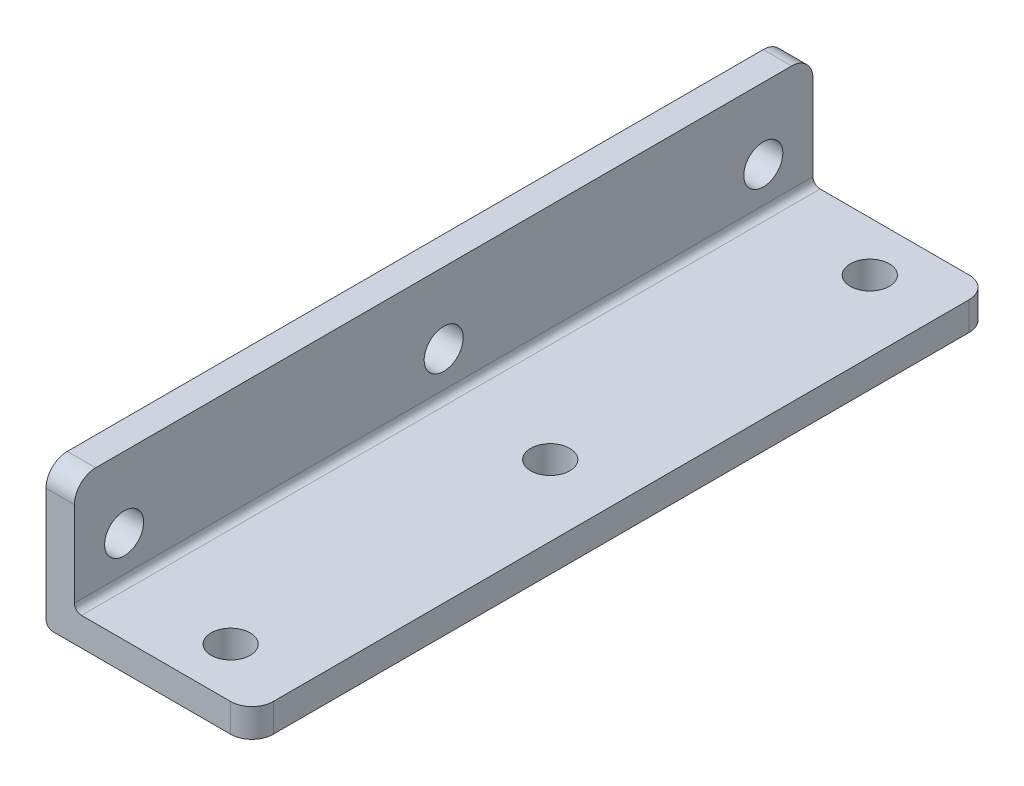
ISO-10303-21;
HEADER;
FILE_DESCRIPTION(('STEP AP214'),'2;1');
FILE_NAME('part.step','',(''),(''),'','','');
FILE_SCHEMA(('AUTOMOTIVE_DESIGN { 1 0 10303 214 1 1 1 1 }'));
ENDSEC;
DATA;
#1=APPLICATION_CONTEXT('core data for automotive mechanical design processes');
#2=APPLICATION_PROTOCOL_DEFINITION('international standard','automotive_design',2000,#1);
#3=PRODUCT_CONTEXT('',#1,'mechanical');
#4=PRODUCT('Part','Part','',(#3));
#5=PRODUCT_RELATED_PRODUCT_CATEGORY('part','',(#4));
#6=PRODUCT_DEFINITION_FORMATION('','',#4);
#7=PRODUCT_DEFINITION_CONTEXT('part definition',#1,'design');
#8=PRODUCT_DEFINITION('design','',#6,#7);
#9=PRODUCT_DEFINITION_SHAPE('','',#8);
#10=(LENGTH_UNIT() NAMED_UNIT(*) SI_UNIT(.MILLI.,.METRE.));
#11=(NAMED_UNIT(*) PLANE_ANGLE_UNIT() SI_UNIT($,.RADIAN.));
#12=(NAMED_UNIT(*) SI_UNIT($,.STERADIAN.) SOLID_ANGLE_UNIT());
#13=UNCERTAINTY_MEASURE_WITH_UNIT(LENGTH_MEASURE(1.E-05),#10,'distance_accuracy_value','');
#14=(GEOMETRIC_REPRESENTATION_CONTEXT(3) GLOBAL_UNCERTAINTY_ASSIGNED_CONTEXT((#13)) GLOBAL_UNIT_ASSIGNED_CONTEXT((#10,
#11,#12)) REPRESENTATION_CONTEXT('',''));
#15=CARTESIAN_POINT('',(0.,0.,0.));
#16=DIRECTION('',(0.,0.,1.));
#17=DIRECTION('',(1.,0.,0.));
#18=AXIS2_PLACEMENT_3D('',#15,#16,#17);
#19=CARTESIAN_POINT('',(29.,0.,55.));
#20=DIRECTION('',(1.,0.,0.));
#21=DIRECTION('',(0.,1.,0.));
#22=AXIS2_PLACEMENT_3D('',#19,#20,#21);
#23=PLANE('',#22);
#24=DIRECTION('',(0.,0.,-1.));
#25=VECTOR('',#24,1.);
#26=CARTESIAN_POINT('',(29.,-3.99999999999998,55.));
#27=LINE('',#26,#25);
#28=CARTESIAN_POINT('',(29.,-3.99999999999998,49.));
#29=VERTEX_POINT('',#28);
#30=CARTESIAN_POINT('',(29.,-3.99999999999998,-49.));
#31=VERTEX_POINT('',#30);
#32=EDGE_CURVE('E245',#29,#31,#27,.T.);
#33=ORIENTED_EDGE('',*,*,#32,.T.);
#34=DIRECTION('',(0.,-1.,0.));
#35=VECTOR('',#34,1.);
#36=CARTESIAN_POINT('',(29.,0.,-49.));
#37=LINE('',#36,#35);
#38=CARTESIAN_POINT('',(29.,0.,-49.));
#39=VERTEX_POINT('',#38);
#40=EDGE_CURVE('E61',#31,#39,#37,.F.);
#41=ORIENTED_EDGE('',*,*,#40,.T.);
#42=DIRECTION('',(0.,0.,-1.));
#43=VECTOR('',#42,1.);
#44=CARTESIAN_POINT('',(29.,0.,55.));
#45=LINE('',#44,#43);
#46=CARTESIAN_POINT('',(29.,0.,49.));
#47=VERTEX_POINT('',#46);
#48=EDGE_CURVE('E156',#47,#39,#45,.T.);
#49=ORIENTED_EDGE('',*,*,#48,.F.);
#50=DIRECTION('',(0.,1.,0.));
#51=VECTOR('',#50,1.);
#52=CARTESIAN_POINT('',(29.,0.,49.));
#53=LINE('',#52,#51);
#54=EDGE_CURVE('E191',#47,#29,#53,.F.);
#55=ORIENTED_EDGE('',*,*,#54,.T.);
#56=EDGE_LOOP('',(#33,#41,#49,#55));
#57=FACE_BOUND('',#56,.T.);
#58=ADVANCED_FACE('F39',(#57),#23,.T.);
#59=CARTESIAN_POINT('',(0.,0.,55.));
#60=DIRECTION('',(0.,1.,0.));
#61=DIRECTION('',(-1.,0.,0.));
#62=AXIS2_PLACEMENT_3D('',#59,#60,#61);
#63=PLANE('',#62);
#64=CARTESIAN_POINT('',(19.,0.,-45.));
#65=DIRECTION('',(0.,1.,0.));
#66=DIRECTION('',(-1.,0.,0.));
#67=AXIS2_PLACEMENT_3D('',#64,#65,#66);
#68=CIRCLE('',#67,2.75);
#69=CARTESIAN_POINT('',(16.25,0.,-45.));
#70=VERTEX_POINT('',#69);
#71=EDGE_CURVE('E225',#70,#70,#68,.T.);
#72=ORIENTED_EDGE('',*,*,#71,.F.);
#73=EDGE_LOOP('',(#72));
#74=FACE_BOUND('',#73,.T.);
#75=CARTESIAN_POINT('',(19.,0.,45.));
#76=DIRECTION('',(0.,1.,0.));
#77=DIRECTION('',(-1.,0.,0.));
#78=AXIS2_PLACEMENT_3D('',#75,#76,#77);
#79=CIRCLE('',#78,2.75);
#80=CARTESIAN_POINT('',(16.25,0.,45.));
#81=VERTEX_POINT('',#80);
#82=EDGE_CURVE('E226',#81,#81,#79,.T.);
#83=ORIENTED_EDGE('',*,*,#82,.F.);
#84=EDGE_LOOP('',(#83));
#85=FACE_BOUND('',#84,.T.);
#86=CARTESIAN_POINT('',(19.,0.,0.));
#87=DIRECTION('',(0.,1.,0.));
#88=DIRECTION('',(-1.,0.,0.));
#89=AXIS2_PLACEMENT_3D('',#86,#87,#88);
#90=CIRCLE('',#89,2.75);
#91=CARTESIAN_POINT('',(16.25,0.,0.));
#92=VERTEX_POINT('',#91);
#93=EDGE_CURVE('E229',#92,#92,#90,.T.);
#94=ORIENTED_EDGE('',*,*,#93,.F.);
#95=EDGE_LOOP('',(#94));
#96=FACE_BOUND('',#95,.T.);
#97=ORIENTED_EDGE('',*,*,#48,.T.);
#98=CARTESIAN_POINT('',(26.,0.,-49.));
#99=DIRECTION('',(0.,1.,0.));
#100=DIRECTION('',(-1.,0.,0.));
#101=AXIS2_PLACEMENT_3D('',#98,#99,#100);
#102=CIRCLE('',#101,3.);
#103=CARTESIAN_POINT('',(26.,0.,-52.));
#104=VERTEX_POINT('',#103);
#105=EDGE_CURVE('E195',#39,#104,#102,.T.);
#106=ORIENTED_EDGE('',*,*,#105,.T.);
#107=DIRECTION('',(1.,0.,0.));
#108=VECTOR('',#107,1.);
#109=CARTESIAN_POINT('',(5.,0.,-52.));
#110=LINE('',#109,#108);
#111=CARTESIAN_POINT('',(5.,0.,-52.));
#112=VERTEX_POINT('',#111);
#113=EDGE_CURVE('E212',#112,#104,#110,.T.);
#114=ORIENTED_EDGE('',*,*,#113,.F.);
#115=DIRECTION('',(0.,0.,-1.));
#116=VECTOR('',#115,1.);
#117=CARTESIAN_POINT('',(5.,0.,55.));
#118=LINE('',#117,#116);
#119=CARTESIAN_POINT('',(5.,0.,52.));
#120=VERTEX_POINT('',#119);
#121=EDGE_CURVE('E168',#112,#120,#118,.F.);
#122=ORIENTED_EDGE('',*,*,#121,.T.);
#123=DIRECTION('',(-1.,0.,0.));
#124=VECTOR('',#123,1.);
#125=CARTESIAN_POINT('',(29.,0.,52.));
#126=LINE('',#125,#124);
#127=CARTESIAN_POINT('',(26.,0.,52.));
#128=VERTEX_POINT('',#127);
#129=EDGE_CURVE('E220',#128,#120,#126,.T.);
#130=ORIENTED_EDGE('',*,*,#129,.F.);
#131=CARTESIAN_POINT('',(26.,0.,49.));
#132=DIRECTION('',(0.,1.,0.));
#133=DIRECTION('',(-1.,0.,0.));
#134=AXIS2_PLACEMENT_3D('',#131,#132,#133);
#135=CIRCLE('',#134,3.);
#136=EDGE_CURVE('E54',#128,#47,#135,.T.);
#137=ORIENTED_EDGE('',*,*,#136,.T.);
#138=EDGE_LOOP('',(#97,#106,#114,#122,#130,#137));
#139=FACE_BOUND('',#138,.T.);
#140=ADVANCED_FACE('F283',(#74,#85,#96,#139),#63,.T.);
#141=CARTESIAN_POINT('',(4.,0.,55.));
#142=DIRECTION('',(-1.,0.,0.));
#143=DIRECTION('',(0.,-1.,0.));
#144=AXIS2_PLACEMENT_3D('',#141,#142,#143);
#145=PLANE('',#144);
#146=CARTESIAN_POINT('',(4.,5.99999999999999,-45.));
#147=DIRECTION('',(1.,0.,0.));
#148=DIRECTION('',(0.,1.,0.));
#149=AXIS2_PLACEMENT_3D('',#146,#147,#148);
#150=CIRCLE('',#149,2.75);
#151=CARTESIAN_POINT('',(4.,8.75,-45.));
#152=VERTEX_POINT('',#151);
#153=EDGE_CURVE('E239',#152,#152,#150,.T.);
#154=ORIENTED_EDGE('',*,*,#153,.F.);
#155=EDGE_LOOP('',(#154));
#156=FACE_BOUND('',#155,.T.);
#157=CARTESIAN_POINT('',(4.,5.99999999999999,45.));
#158=DIRECTION('',(1.,0.,0.));
#159=DIRECTION('',(0.,1.,0.));
#160=AXIS2_PLACEMENT_3D('',#157,#158,#159);
#161=CIRCLE('',#160,2.75);
#162=CARTESIAN_POINT('',(4.,8.75,45.));
#163=VERTEX_POINT('',#162);
#164=EDGE_CURVE('E235',#163,#163,#161,.T.);
#165=ORIENTED_EDGE('',*,*,#164,.F.);
#166=EDGE_LOOP('',(#165));
#167=FACE_BOUND('',#166,.T.);
#168=CARTESIAN_POINT('',(4.,5.99999999999999,0.));
#169=DIRECTION('',(1.,0.,0.));
#170=DIRECTION('',(0.,1.,0.));
#171=AXIS2_PLACEMENT_3D('',#168,#169,#170);
#172=CIRCLE('',#171,2.75);
#173=CARTESIAN_POINT('',(4.,8.74999999999999,0.));
#174=VERTEX_POINT('',#173);
#175=EDGE_CURVE('E238',#174,#174,#172,.T.);
#176=ORIENTED_EDGE('',*,*,#175,.F.);
#177=EDGE_LOOP('',(#176));
#178=FACE_BOUND('',#177,.T.);
#179=DIRECTION('',(0.,-1.,0.));
#180=VECTOR('',#179,1.);
#181=CARTESIAN_POINT('',(4.,16.,-52.));
#182=LINE('',#181,#180);
#183=CARTESIAN_POINT('',(4.,13.,-52.));
#184=VERTEX_POINT('',#183);
#185=CARTESIAN_POINT('',(4.,1.,-52.));
#186=VERTEX_POINT('',#185);
#187=EDGE_CURVE('E330',#184,#186,#182,.T.);
#188=ORIENTED_EDGE('',*,*,#187,.F.);
#189=CARTESIAN_POINT('',(4.,13.,-49.));
#190=DIRECTION('',(-1.,0.,0.));
#191=DIRECTION('',(0.,-1.,0.));
#192=AXIS2_PLACEMENT_3D('',#189,#190,#191);
#193=CIRCLE('',#192,3.);
#194=CARTESIAN_POINT('',(4.,16.,-49.));
#195=VERTEX_POINT('',#194);
#196=EDGE_CURVE('E177',#184,#195,#193,.F.);
#197=ORIENTED_EDGE('',*,*,#196,.T.);
#198=DIRECTION('',(0.,0.,-1.));
#199=VECTOR('',#198,1.);
#200=CARTESIAN_POINT('',(4.,16.,55.));
#201=LINE('',#200,#199);
#202=CARTESIAN_POINT('',(4.,16.,49.));
#203=VERTEX_POINT('',#202);
#204=EDGE_CURVE('E160',#203,#195,#201,.T.);
#205=ORIENTED_EDGE('',*,*,#204,.F.);
#206=CARTESIAN_POINT('',(4.,13.,49.));
#207=DIRECTION('',(-1.,0.,0.));
#208=DIRECTION('',(0.,-1.,0.));
#209=AXIS2_PLACEMENT_3D('',#206,#207,#208);
#210=CIRCLE('',#209,3.);
#211=CARTESIAN_POINT('',(4.,13.,52.));
#212=VERTEX_POINT('',#211);
#213=EDGE_CURVE('E175',#203,#212,#210,.F.);
#214=ORIENTED_EDGE('',*,*,#213,.T.);
#215=DIRECTION('',(0.,1.,0.));
#216=VECTOR('',#215,1.);
#217=CARTESIAN_POINT('',(4.,1.,52.));
#218=LINE('',#217,#216);
#219=CARTESIAN_POINT('',(4.,1.,52.));
#220=VERTEX_POINT('',#219);
#221=EDGE_CURVE('E204',#220,#212,#218,.T.);
#222=ORIENTED_EDGE('',*,*,#221,.F.);
#223=DIRECTION('',(0.,0.,-1.));
#224=VECTOR('',#223,1.);
#225=CARTESIAN_POINT('',(4.,1.,55.));
#226=LINE('',#225,#224);
#227=EDGE_CURVE('E158',#220,#186,#226,.T.);
#228=ORIENTED_EDGE('',*,*,#227,.T.);
#229=EDGE_LOOP('',(#188,#197,#205,#214,#222,#228));
#230=FACE_BOUND('',#229,.T.);
#231=ADVANCED_FACE('F288',(#156,#167,#178,#230),#145,.F.);
#232=CARTESIAN_POINT('',(0.,16.,55.));
#233=DIRECTION('',(0.,1.,0.));
#234=DIRECTION('',(0.,0.,1.));
#235=AXIS2_PLACEMENT_3D('',#232,#233,#234);
#236=PLANE('',#235);
#237=ORIENTED_EDGE('',*,*,#204,.T.);
#238=DIRECTION('',(1.,0.,0.));
#239=VECTOR('',#238,1.);
#240=CARTESIAN_POINT('',(0.,16.,-49.));
#241=LINE('',#240,#239);
#242=CARTESIAN_POINT('',(0.,16.,-49.));
#243=VERTEX_POINT('',#242);
#244=EDGE_CURVE('E181',#195,#243,#241,.F.);
#245=ORIENTED_EDGE('',*,*,#244,.T.);
#246=DIRECTION('',(0.,0.,-1.));
#247=VECTOR('',#246,1.);
#248=CARTESIAN_POINT('',(0.,16.,55.));
#249=LINE('',#248,#247);
#250=CARTESIAN_POINT('',(0.,16.,49.));
#251=VERTEX_POINT('',#250);
#252=EDGE_CURVE('E247',#251,#243,#249,.T.);
#253=ORIENTED_EDGE('',*,*,#252,.F.);
#254=DIRECTION('',(-1.,0.,0.));
#255=VECTOR('',#254,1.);
#256=CARTESIAN_POINT('',(0.,16.,49.));
#257=LINE('',#256,#255);
#258=EDGE_CURVE('E179',#251,#203,#257,.F.);
#259=ORIENTED_EDGE('',*,*,#258,.T.);
#260=EDGE_LOOP('',(#237,#245,#253,#259));
#261=FACE_BOUND('',#260,.T.);
#262=ADVANCED_FACE('F326',(#261),#236,.T.);
#263=CARTESIAN_POINT('',(0.,0.,55.));
#264=DIRECTION('',(1.,0.,0.));
#265=DIRECTION('',(0.,1.,0.));
#266=AXIS2_PLACEMENT_3D('',#263,#264,#265);
#267=PLANE('',#266);
#268=CARTESIAN_POINT('',(0.,5.99999999999999,-45.));
#269=DIRECTION('',(1.,0.,0.));
#270=DIRECTION('',(0.,1.,0.));
#271=AXIS2_PLACEMENT_3D('',#268,#269,#270);
#272=CIRCLE('',#271,2.75);
#273=CARTESIAN_POINT('',(0.,8.74999999999999,-45.));
#274=VERTEX_POINT('',#273);
#275=EDGE_CURVE('E248',#274,#274,#272,.T.);
#276=ORIENTED_EDGE('',*,*,#275,.T.);
#277=EDGE_LOOP('',(#276));
#278=FACE_BOUND('',#277,.T.);
#279=CARTESIAN_POINT('',(0.,5.99999999999999,45.));
#280=DIRECTION('',(1.,0.,0.));
#281=DIRECTION('',(0.,1.,0.));
#282=AXIS2_PLACEMENT_3D('',#279,#280,#281);
#283=CIRCLE('',#282,2.75);
#284=CARTESIAN_POINT('',(0.,8.74999999999999,45.));
#285=VERTEX_POINT('',#284);
#286=EDGE_CURVE('E254',#285,#285,#283,.T.);
#287=ORIENTED_EDGE('',*,*,#286,.T.);
#288=EDGE_LOOP('',(#287));
#289=FACE_BOUND('',#288,.T.);
#290=CARTESIAN_POINT('',(0.,5.99999999999999,0.));
#291=DIRECTION('',(1.,0.,0.));
#292=DIRECTION('',(0.,1.,0.));
#293=AXIS2_PLACEMENT_3D('',#290,#291,#292);
#294=CIRCLE('',#293,2.75);
#295=CARTESIAN_POINT('',(0.,8.74999999999999,0.));
#296=VERTEX_POINT('',#295);
#297=EDGE_CURVE('E244',#296,#296,#294,.T.);
#298=ORIENTED_EDGE('',*,*,#297,.T.);
#299=EDGE_LOOP('',(#298));
#300=FACE_BOUND('',#299,.T.);
#301=ORIENTED_EDGE('',*,*,#252,.T.);
#302=CARTESIAN_POINT('',(0.,13.,-49.));
#303=DIRECTION('',(1.,0.,0.));
#304=DIRECTION('',(0.,1.,0.));
#305=AXIS2_PLACEMENT_3D('',#302,#303,#304);
#306=CIRCLE('',#305,3.);
#307=CARTESIAN_POINT('',(0.,13.,-52.));
#308=VERTEX_POINT('',#307);
#309=EDGE_CURVE('E185',#243,#308,#306,.F.);
#310=ORIENTED_EDGE('',*,*,#309,.T.);
#311=DIRECTION('',(0.,1.,0.));
#312=VECTOR('',#311,1.);
#313=CARTESIAN_POINT('',(0.,-2.99999999999998,-52.));
#314=LINE('',#313,#312);
#315=CARTESIAN_POINT('',(0.,-2.99999999999998,-52.));
#316=VERTEX_POINT('',#315);
#317=EDGE_CURVE('E150',#316,#308,#314,.T.);
#318=ORIENTED_EDGE('',*,*,#317,.F.);
#319=DIRECTION('',(0.,0.,-1.));
#320=VECTOR('',#319,1.);
#321=CARTESIAN_POINT('',(0.,-2.99999999999998,55.));
#322=LINE('',#321,#320);
#323=CARTESIAN_POINT('',(0.,-2.99999999999998,52.));
#324=VERTEX_POINT('',#323);
#325=EDGE_CURVE('E149',#316,#324,#322,.F.);
#326=ORIENTED_EDGE('',*,*,#325,.T.);
#327=DIRECTION('',(0.,-1.,0.));
#328=VECTOR('',#327,1.);
#329=CARTESIAN_POINT('',(0.,16.,52.));
#330=LINE('',#329,#328);
#331=CARTESIAN_POINT('',(0.,13.,52.));
#332=VERTEX_POINT('',#331);
#333=EDGE_CURVE('E202',#332,#324,#330,.T.);
#334=ORIENTED_EDGE('',*,*,#333,.F.);
#335=CARTESIAN_POINT('',(0.,13.,49.));
#336=DIRECTION('',(1.,0.,0.));
#337=DIRECTION('',(0.,1.,0.));
#338=AXIS2_PLACEMENT_3D('',#335,#336,#337);
#339=CIRCLE('',#338,3.);
#340=EDGE_CURVE('E183',#332,#251,#339,.F.);
#341=ORIENTED_EDGE('',*,*,#340,.T.);
#342=EDGE_LOOP('',(#301,#310,#318,#326,#334,#341));
#343=FACE_BOUND('',#342,.T.);
#344=ADVANCED_FACE('F209',(#278,#289,#300,#343),#267,.F.);
#345=CARTESIAN_POINT('',(0.,-3.99999999999998,55.));
#346=DIRECTION('',(0.,1.,0.));
#347=DIRECTION('',(0.,0.,1.));
#348=AXIS2_PLACEMENT_3D('',#345,#346,#347);
#349=PLANE('',#348);
#350=CARTESIAN_POINT('',(19.,-3.99999999999998,-45.));
#351=DIRECTION('',(0.,1.,0.));
#352=DIRECTION('',(0.,0.,1.));
#353=AXIS2_PLACEMENT_3D('',#350,#351,#352);
#354=CIRCLE('',#353,2.75);
#355=CARTESIAN_POINT('',(19.,-3.99999999999998,-42.25));
#356=VERTEX_POINT('',#355);
#357=EDGE_CURVE('E163',#356,#356,#354,.T.);
#358=ORIENTED_EDGE('',*,*,#357,.T.);
#359=EDGE_LOOP('',(#358));
#360=FACE_BOUND('',#359,.T.);
#361=CARTESIAN_POINT('',(19.,-3.99999999999998,45.));
#362=DIRECTION('',(0.,1.,0.));
#363=DIRECTION('',(0.,0.,1.));
#364=AXIS2_PLACEMENT_3D('',#361,#362,#363);
#365=CIRCLE('',#364,2.75);
#366=CARTESIAN_POINT('',(19.,-3.99999999999998,47.75));
#367=VERTEX_POINT('',#366);
#368=EDGE_CURVE('E260',#367,#367,#365,.T.);
#369=ORIENTED_EDGE('',*,*,#368,.T.);
#370=EDGE_LOOP('',(#369));
#371=FACE_BOUND('',#370,.T.);
#372=CARTESIAN_POINT('',(19.,-3.99999999999998,0.));
#373=DIRECTION('',(0.,1.,0.));
#374=DIRECTION('',(0.,0.,1.));
#375=AXIS2_PLACEMENT_3D('',#372,#373,#374);
#376=CIRCLE('',#375,2.75);
#377=CARTESIAN_POINT('',(19.,-3.99999999999998,2.75));
#378=VERTEX_POINT('',#377);
#379=EDGE_CURVE('E234',#378,#378,#376,.T.);
#380=ORIENTED_EDGE('',*,*,#379,.T.);
#381=EDGE_LOOP('',(#380));
#382=FACE_BOUND('',#381,.T.);
#383=DIRECTION('',(-1.,0.,0.));
#384=VECTOR('',#383,1.);
#385=CARTESIAN_POINT('',(29.,-3.99999999999998,-52.));
#386=LINE('',#385,#384);
#387=CARTESIAN_POINT('',(26.,-3.99999999999998,-52.));
#388=VERTEX_POINT('',#387);
#389=CARTESIAN_POINT('',(1.,-3.99999999999998,-52.));
#390=VERTEX_POINT('',#389);
#391=EDGE_CURVE('E130',#388,#390,#386,.T.);
#392=ORIENTED_EDGE('',*,*,#391,.F.);
#393=CARTESIAN_POINT('',(26.,-3.99999999999998,-49.));
#394=DIRECTION('',(0.,1.,0.));
#395=DIRECTION('',(0.,0.,1.));
#396=AXIS2_PLACEMENT_3D('',#393,#394,#395);
#397=CIRCLE('',#396,3.);
#398=EDGE_CURVE('E189',#388,#31,#397,.F.);
#399=ORIENTED_EDGE('',*,*,#398,.T.);
#400=ORIENTED_EDGE('',*,*,#32,.F.);
#401=CARTESIAN_POINT('',(26.,-3.99999999999998,49.));
#402=DIRECTION('',(0.,1.,0.));
#403=DIRECTION('',(0.,0.,1.));
#404=AXIS2_PLACEMENT_3D('',#401,#402,#403);
#405=CIRCLE('',#404,3.);
#406=CARTESIAN_POINT('',(26.,-3.99999999999998,52.));
#407=VERTEX_POINT('',#406);
#408=EDGE_CURVE('E187',#29,#407,#405,.F.);
#409=ORIENTED_EDGE('',*,*,#408,.T.);
#410=DIRECTION('',(1.,0.,0.));
#411=VECTOR('',#410,1.);
#412=CARTESIAN_POINT('',(1.,-3.99999999999998,52.));
#413=LINE('',#412,#411);
#414=CARTESIAN_POINT('',(1.,-3.99999999999998,52.));
#415=VERTEX_POINT('',#414);
#416=EDGE_CURVE('E155',#415,#407,#413,.T.);
#417=ORIENTED_EDGE('',*,*,#416,.F.);
#418=DIRECTION('',(0.,0.,-1.));
#419=VECTOR('',#418,1.);
#420=CARTESIAN_POINT('',(1.,-3.99999999999998,55.));
#421=LINE('',#420,#419);
#422=EDGE_CURVE('E147',#415,#390,#421,.T.);
#423=ORIENTED_EDGE('',*,*,#422,.T.);
#424=EDGE_LOOP('',(#392,#399,#400,#409,#417,#423));
#425=FACE_BOUND('',#424,.T.);
#426=ADVANCED_FACE('F153',(#360,#371,#382,#425),#349,.F.);
#427=CARTESIAN_POINT('',(1.,-2.99999999999998,55.));
#428=DIRECTION('',(0.,0.,-1.));
#429=DIRECTION('',(-1.,0.,0.));
#430=AXIS2_PLACEMENT_3D('',#427,#428,#429);
#431=CYLINDRICAL_SURFACE('',#430,1.);
#432=ORIENTED_EDGE('',*,*,#325,.F.);
#433=CARTESIAN_POINT('',(1.,-2.99999999999998,-52.));
#434=DIRECTION('',(0.,0.,-1.));
#435=DIRECTION('',(-1.,0.,0.));
#436=AXIS2_PLACEMENT_3D('',#433,#434,#435);
#437=CIRCLE('',#436,1.);
#438=EDGE_CURVE('E134',#390,#316,#437,.T.);
#439=ORIENTED_EDGE('',*,*,#438,.F.);
#440=ORIENTED_EDGE('',*,*,#422,.F.);
#441=CARTESIAN_POINT('',(1.,-2.99999999999998,52.));
#442=DIRECTION('',(0.,0.,1.));
#443=DIRECTION('',(1.,0.,0.));
#444=AXIS2_PLACEMENT_3D('',#441,#442,#443);
#445=CIRCLE('',#444,1.);
#446=EDGE_CURVE('E211',#324,#415,#445,.T.);
#447=ORIENTED_EDGE('',*,*,#446,.F.);
#448=EDGE_LOOP('',(#432,#439,#440,#447));
#449=FACE_BOUND('',#448,.T.);
#450=ADVANCED_FACE('F145',(#449),#431,.T.);
#451=CARTESIAN_POINT('',(5.,1.,55.));
#452=DIRECTION('',(0.,0.,-1.));
#453=DIRECTION('',(-1.,0.,0.));
#454=AXIS2_PLACEMENT_3D('',#451,#452,#453);
#455=CYLINDRICAL_SURFACE('',#454,1.);
#456=CARTESIAN_POINT('',(5.,1.,-52.));
#457=DIRECTION('',(0.,0.,1.));
#458=DIRECTION('',(-1.,0.,0.));
#459=AXIS2_PLACEMENT_3D('',#456,#457,#458);
#460=CIRCLE('',#459,1.);
#461=EDGE_CURVE('E215',#186,#112,#460,.T.);
#462=ORIENTED_EDGE('',*,*,#461,.F.);
#463=ORIENTED_EDGE('',*,*,#227,.F.);
#464=CARTESIAN_POINT('',(5.,1.,52.));
#465=DIRECTION('',(0.,0.,-1.));
#466=DIRECTION('',(1.,0.,0.));
#467=AXIS2_PLACEMENT_3D('',#464,#465,#466);
#468=CIRCLE('',#467,1.);
#469=EDGE_CURVE('E222',#120,#220,#468,.T.);
#470=ORIENTED_EDGE('',*,*,#469,.F.);
#471=ORIENTED_EDGE('',*,*,#121,.F.);
#472=EDGE_LOOP('',(#462,#463,#470,#471));
#473=FACE_BOUND('',#472,.T.);
#474=ADVANCED_FACE('F295',(#473),#455,.F.);
#475=CARTESIAN_POINT('',(-16.,5.99999999999999,0.));
#476=DIRECTION('',(1.,0.,0.));
#477=DIRECTION('',(0.,1.,0.));
#478=AXIS2_PLACEMENT_3D('',#475,#476,#477);
#479=CYLINDRICAL_SURFACE('',#478,2.75);
#480=ORIENTED_EDGE('',*,*,#175,.T.);
#481=EDGE_LOOP('',(#480));
#482=FACE_BOUND('',#481,.T.);
#483=ORIENTED_EDGE('',*,*,#297,.F.);
#484=EDGE_LOOP('',(#483));
#485=FACE_BOUND('',#484,.T.);
#486=ADVANCED_FACE('F298',(#482,#485),#479,.F.);
#487=CARTESIAN_POINT('',(-16.,5.99999999999999,45.));
#488=DIRECTION('',(1.,0.,0.));
#489=DIRECTION('',(0.,1.,0.));
#490=AXIS2_PLACEMENT_3D('',#487,#488,#489);
#491=CYLINDRICAL_SURFACE('',#490,2.75);
#492=ORIENTED_EDGE('',*,*,#164,.T.);
#493=EDGE_LOOP('',(#492));
#494=FACE_BOUND('',#493,.T.);
#495=ORIENTED_EDGE('',*,*,#286,.F.);
#496=EDGE_LOOP('',(#495));
#497=FACE_BOUND('',#496,.T.);
#498=ADVANCED_FACE('F348',(#494,#497),#491,.F.);
#499=CARTESIAN_POINT('',(-16.,5.99999999999999,-45.));
#500=DIRECTION('',(1.,0.,0.));
#501=DIRECTION('',(0.,1.,0.));
#502=AXIS2_PLACEMENT_3D('',#499,#500,#501);
#503=CYLINDRICAL_SURFACE('',#502,2.75);
#504=ORIENTED_EDGE('',*,*,#153,.T.);
#505=EDGE_LOOP('',(#504));
#506=FACE_BOUND('',#505,.T.);
#507=ORIENTED_EDGE('',*,*,#275,.F.);
#508=EDGE_LOOP('',(#507));
#509=FACE_BOUND('',#508,.T.);
#510=ADVANCED_FACE('F350',(#506,#509),#503,.F.);
#511=CARTESIAN_POINT('',(19.,-20.,0.));
#512=DIRECTION('',(0.,1.,0.));
#513=DIRECTION('',(-1.,0.,0.));
#514=AXIS2_PLACEMENT_3D('',#511,#512,#513);
#515=CYLINDRICAL_SURFACE('',#514,2.75);
#516=ORIENTED_EDGE('',*,*,#93,.T.);
#517=EDGE_LOOP('',(#516));
#518=FACE_BOUND('',#517,.T.);
#519=ORIENTED_EDGE('',*,*,#379,.F.);
#520=EDGE_LOOP('',(#519));
#521=FACE_BOUND('',#520,.T.);
#522=ADVANCED_FACE('F278',(#518,#521),#515,.F.);
#523=CARTESIAN_POINT('',(19.,-20.,45.));
#524=DIRECTION('',(0.,1.,0.));
#525=DIRECTION('',(-1.,0.,0.));
#526=AXIS2_PLACEMENT_3D('',#523,#524,#525);
#527=CYLINDRICAL_SURFACE('',#526,2.75);
#528=ORIENTED_EDGE('',*,*,#82,.T.);
#529=EDGE_LOOP('',(#528));
#530=FACE_BOUND('',#529,.T.);
#531=ORIENTED_EDGE('',*,*,#368,.F.);
#532=EDGE_LOOP('',(#531));
#533=FACE_BOUND('',#532,.T.);
#534=ADVANCED_FACE('F270',(#530,#533),#527,.F.);
#535=CARTESIAN_POINT('',(19.,-20.,-45.));
#536=DIRECTION('',(0.,1.,0.));
#537=DIRECTION('',(-1.,0.,0.));
#538=AXIS2_PLACEMENT_3D('',#535,#536,#537);
#539=CYLINDRICAL_SURFACE('',#538,2.75);
#540=ORIENTED_EDGE('',*,*,#71,.T.);
#541=EDGE_LOOP('',(#540));
#542=FACE_BOUND('',#541,.T.);
#543=ORIENTED_EDGE('',*,*,#357,.F.);
#544=EDGE_LOOP('',(#543));
#545=FACE_BOUND('',#544,.T.);
#546=ADVANCED_FACE('F268',(#542,#545),#539,.F.);
#547=CARTESIAN_POINT('',(1.,-2.99999999999998,52.));
#548=DIRECTION('',(0.,0.,1.));
#549=DIRECTION('',(1.,0.,0.));
#550=AXIS2_PLACEMENT_3D('',#547,#548,#549);
#551=PLANE('',#550);
#552=ORIENTED_EDGE('',*,*,#416,.T.);
#553=DIRECTION('',(0.,1.,0.));
#554=VECTOR('',#553,1.);
#555=CARTESIAN_POINT('',(26.,-2.99999999999993,52.));
#556=LINE('',#555,#554);
#557=EDGE_CURVE('E11',#407,#128,#556,.T.);
#558=ORIENTED_EDGE('',*,*,#557,.T.);
#559=ORIENTED_EDGE('',*,*,#129,.T.);
#560=ORIENTED_EDGE('',*,*,#469,.T.);
#561=ORIENTED_EDGE('',*,*,#221,.T.);
#562=DIRECTION('',(-1.,0.,0.));
#563=VECTOR('',#562,1.);
#564=CARTESIAN_POINT('',(1.,13.,52.));
#565=LINE('',#564,#563);
#566=EDGE_CURVE('E47',#212,#332,#565,.T.);
#567=ORIENTED_EDGE('',*,*,#566,.T.);
#568=ORIENTED_EDGE('',*,*,#333,.T.);
#569=ORIENTED_EDGE('',*,*,#446,.T.);
#570=EDGE_LOOP('',(#552,#558,#559,#560,#561,#567,#568,#569));
#571=FACE_BOUND('',#570,.T.);
#572=ADVANCED_FACE('F201',(#571),#551,.T.);
#573=CARTESIAN_POINT('',(1.,-2.99999999999998,-52.));
#574=DIRECTION('',(0.,0.,-1.));
#575=DIRECTION('',(-1.,0.,0.));
#576=AXIS2_PLACEMENT_3D('',#573,#574,#575);
#577=PLANE('',#576);
#578=ORIENTED_EDGE('',*,*,#317,.T.);
#579=DIRECTION('',(1.,0.,0.));
#580=VECTOR('',#579,1.);
#581=CARTESIAN_POINT('',(1.,13.,-52.));
#582=LINE('',#581,#580);
#583=EDGE_CURVE('E172',#308,#184,#582,.T.);
#584=ORIENTED_EDGE('',*,*,#583,.T.);
#585=ORIENTED_EDGE('',*,*,#187,.T.);
#586=ORIENTED_EDGE('',*,*,#461,.T.);
#587=ORIENTED_EDGE('',*,*,#113,.T.);
#588=DIRECTION('',(0.,-1.,0.));
#589=VECTOR('',#588,1.);
#590=CARTESIAN_POINT('',(26.,-2.99999999999993,-52.));
#591=LINE('',#590,#589);
#592=EDGE_CURVE('E138',#104,#388,#591,.T.);
#593=ORIENTED_EDGE('',*,*,#592,.T.);
#594=ORIENTED_EDGE('',*,*,#391,.T.);
#595=ORIENTED_EDGE('',*,*,#438,.T.);
#596=EDGE_LOOP('',(#578,#584,#585,#586,#587,#593,#594,#595));
#597=FACE_BOUND('',#596,.T.);
#598=ADVANCED_FACE('F133',(#597),#577,.T.);
#599=CARTESIAN_POINT('',(1.,13.,-49.));
#600=DIRECTION('',(1.,0.,0.));
#601=DIRECTION('',(0.,0.,-1.));
#602=AXIS2_PLACEMENT_3D('',#599,#600,#601);
#603=CYLINDRICAL_SURFACE('',#602,3.);
#604=ORIENTED_EDGE('',*,*,#309,.F.);
#605=ORIENTED_EDGE('',*,*,#244,.F.);
#606=ORIENTED_EDGE('',*,*,#196,.F.);
#607=ORIENTED_EDGE('',*,*,#583,.F.);
#608=EDGE_LOOP('',(#604,#605,#606,#607));
#609=FACE_BOUND('',#608,.T.);
#610=ADVANCED_FACE('F300',(#609),#603,.T.);
#611=CARTESIAN_POINT('',(26.,-2.99999999999993,-49.));
#612=DIRECTION('',(0.,-1.,0.));
#613=DIRECTION('',(1.,0.,0.));
#614=AXIS2_PLACEMENT_3D('',#611,#612,#613);
#615=CYLINDRICAL_SURFACE('',#614,3.);
#616=ORIENTED_EDGE('',*,*,#105,.F.);
#617=ORIENTED_EDGE('',*,*,#40,.F.);
#618=ORIENTED_EDGE('',*,*,#398,.F.);
#619=ORIENTED_EDGE('',*,*,#592,.F.);
#620=EDGE_LOOP('',(#616,#617,#618,#619));
#621=FACE_BOUND('',#620,.T.);
#622=ADVANCED_FACE('F303',(#621),#615,.T.);
#623=CARTESIAN_POINT('',(26.,-2.99999999999993,49.));
#624=DIRECTION('',(0.,1.,0.));
#625=DIRECTION('',(-1.,0.,0.));
#626=AXIS2_PLACEMENT_3D('',#623,#624,#625);
#627=CYLINDRICAL_SURFACE('',#626,3.);
#628=ORIENTED_EDGE('',*,*,#408,.F.);
#629=ORIENTED_EDGE('',*,*,#54,.F.);
#630=ORIENTED_EDGE('',*,*,#136,.F.);
#631=ORIENTED_EDGE('',*,*,#557,.F.);
#632=EDGE_LOOP('',(#628,#629,#630,#631));
#633=FACE_BOUND('',#632,.T.);
#634=ADVANCED_FACE('F306',(#633),#627,.T.);
#635=CARTESIAN_POINT('',(1.,13.,49.));
#636=DIRECTION('',(-1.,0.,0.));
#637=DIRECTION('',(0.,0.,1.));
#638=AXIS2_PLACEMENT_3D('',#635,#636,#637);
#639=CYLINDRICAL_SURFACE('',#638,3.);
#640=ORIENTED_EDGE('',*,*,#213,.F.);
#641=ORIENTED_EDGE('',*,*,#258,.F.);
#642=ORIENTED_EDGE('',*,*,#340,.F.);
#643=ORIENTED_EDGE('',*,*,#566,.F.);
#644=EDGE_LOOP('',(#640,#641,#642,#643));
#645=FACE_BOUND('',#644,.T.);
#646=ADVANCED_FACE('F41',(#645),#639,.T.);
#647=CLOSED_SHELL('',(#58,#140,#231,#262,#344,#426,#450,#474,#486,#498,#510,#522,#534,#546,#572,
#598,#610,#622,#634,#646));
#648=MANIFOLD_SOLID_BREP('B2',#647);
#649=ADVANCED_BREP_SHAPE_REPRESENTATION('',(#18,#648),#14);
#650=SHAPE_DEFINITION_REPRESENTATION(#9,#649);
ENDSEC;
END-ISO-10303-21;
